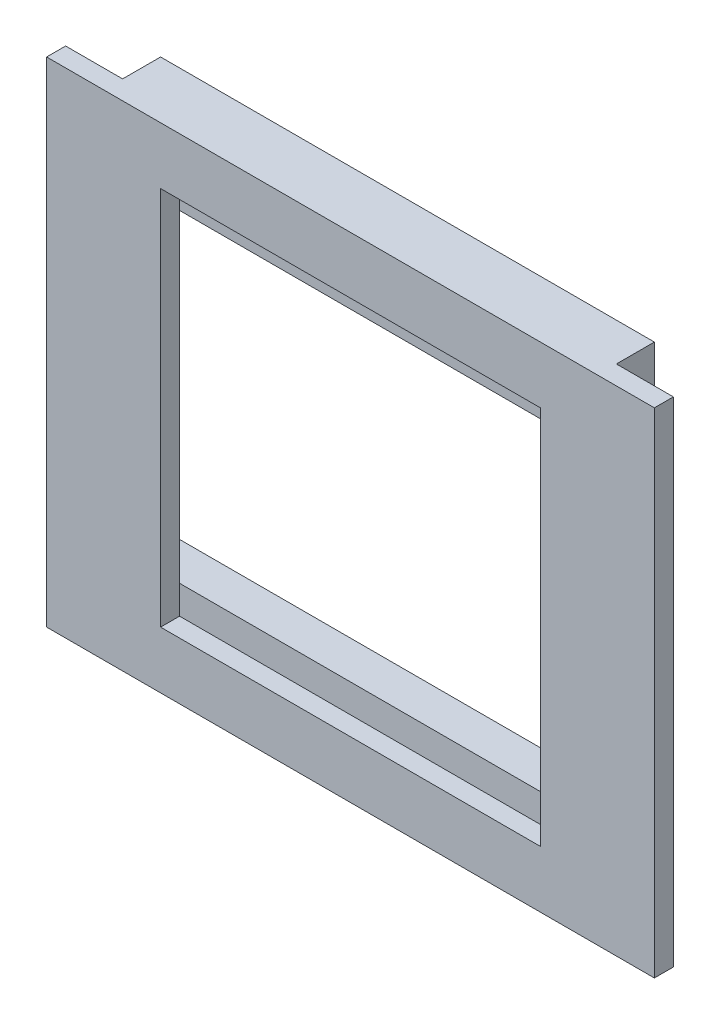
ISO-10303-21;
HEADER;
FILE_DESCRIPTION(('STEP AP214'),'2;1');
FILE_NAME('part.step','',(''),(''),'','','');
FILE_SCHEMA(('AUTOMOTIVE_DESIGN { 1 0 10303 214 1 1 1 1 }'));
ENDSEC;
DATA;
#1=APPLICATION_CONTEXT('core data for automotive mechanical design processes');
#2=APPLICATION_PROTOCOL_DEFINITION('international standard','automotive_design',2000,#1);
#3=PRODUCT_CONTEXT('',#1,'mechanical');
#4=PRODUCT('Part','Part','',(#3));
#5=PRODUCT_RELATED_PRODUCT_CATEGORY('part','',(#4));
#6=PRODUCT_DEFINITION_FORMATION('','',#4);
#7=PRODUCT_DEFINITION_CONTEXT('part definition',#1,'design');
#8=PRODUCT_DEFINITION('design','',#6,#7);
#9=PRODUCT_DEFINITION_SHAPE('','',#8);
#10=(LENGTH_UNIT() NAMED_UNIT(*) SI_UNIT(.MILLI.,.METRE.));
#11=(NAMED_UNIT(*) PLANE_ANGLE_UNIT() SI_UNIT($,.RADIAN.));
#12=(NAMED_UNIT(*) SI_UNIT($,.STERADIAN.) SOLID_ANGLE_UNIT());
#13=UNCERTAINTY_MEASURE_WITH_UNIT(LENGTH_MEASURE(1.E-05),#10,'distance_accuracy_value','');
#14=(GEOMETRIC_REPRESENTATION_CONTEXT(3) GLOBAL_UNCERTAINTY_ASSIGNED_CONTEXT((#13)) GLOBAL_UNIT_ASSIGNED_CONTEXT((#10,
#11,#12)) REPRESENTATION_CONTEXT('',''));
#15=CARTESIAN_POINT('',(0.,0.,0.));
#16=DIRECTION('',(0.,0.,1.));
#17=DIRECTION('',(1.,0.,0.));
#18=AXIS2_PLACEMENT_3D('',#15,#16,#17);
#19=CARTESIAN_POINT('',(0.,0.,10.));
#20=DIRECTION('',(0.,0.,1.));
#21=DIRECTION('',(1.,0.,0.));
#22=AXIS2_PLACEMENT_3D('',#19,#20,#21);
#23=PLANE('',#22);
#24=DIRECTION('',(1.,0.,0.));
#25=VECTOR('',#24,1.);
#26=CARTESIAN_POINT('',(0.,-56.3702928870293,10.));
#27=LINE('',#26,#25);
#28=CARTESIAN_POINT('',(-59.5188284518828,-56.3702928870293,9.99999999999999));
#29=VERTEX_POINT('',#28);
#30=CARTESIAN_POINT('',(40.4811715481172,-56.3702928870293,9.99999999999999));
#31=VERTEX_POINT('',#30);
#32=EDGE_CURVE('E285',#29,#31,#27,.T.);
#33=ORIENTED_EDGE('',*,*,#32,.F.);
#34=DIRECTION('',(0.,1.,0.));
#35=VECTOR('',#34,1.);
#36=CARTESIAN_POINT('',(-59.5188284518828,0.,10.));
#37=LINE('',#36,#35);
#38=CARTESIAN_POINT('',(-59.5188284518828,-63.8702928870293,10.));
#39=VERTEX_POINT('',#38);
#40=EDGE_CURVE('E301',#39,#29,#37,.T.);
#41=ORIENTED_EDGE('',*,*,#40,.F.);
#42=DIRECTION('',(1.,0.,0.));
#43=VECTOR('',#42,1.);
#44=CARTESIAN_POINT('',(0.,-63.8702928870293,10.));
#45=LINE('',#44,#43);
#46=CARTESIAN_POINT('',(40.4811715481172,-63.8702928870293,10.));
#47=VERTEX_POINT('',#46);
#48=EDGE_CURVE('E289',#39,#47,#45,.T.);
#49=ORIENTED_EDGE('',*,*,#48,.T.);
#50=DIRECTION('',(0.,1.,0.));
#51=VECTOR('',#50,1.);
#52=CARTESIAN_POINT('',(40.4811715481172,0.,10.));
#53=LINE('',#52,#51);
#54=EDGE_CURVE('E294',#47,#31,#53,.T.);
#55=ORIENTED_EDGE('',*,*,#54,.T.);
#56=EDGE_LOOP('',(#33,#41,#49,#55));
#57=FACE_BOUND('',#56,.T.);
#58=ADVANCED_FACE('F37',(#57),#23,.T.);
#59=CARTESIAN_POINT('',(0.,0.,0.));
#60=DIRECTION('',(0.,0.,1.));
#61=DIRECTION('',(1.,0.,0.));
#62=AXIS2_PLACEMENT_3D('',#59,#60,#61);
#63=PLANE('',#62);
#64=DIRECTION('',(0.,-1.,0.));
#65=VECTOR('',#64,1.);
#66=CARTESIAN_POINT('',(-74.5188284518828,51.1297071129707,0.));
#67=LINE('',#66,#65);
#68=CARTESIAN_POINT('',(-74.5188284518828,-56.3702928870293,0.));
#69=VERTEX_POINT('',#68);
#70=CARTESIAN_POINT('',(-74.5188284518828,-78.8702928870293,0.));
#71=VERTEX_POINT('',#70);
#72=EDGE_CURVE('E231',#69,#71,#67,.T.);
#73=ORIENTED_EDGE('',*,*,#72,.F.);
#74=DIRECTION('',(1.,0.,0.));
#75=VECTOR('',#74,1.);
#76=CARTESIAN_POINT('',(0.,-56.3702928870293,0.));
#77=LINE('',#76,#75);
#78=CARTESIAN_POINT('',(55.4811715481172,-56.3702928870293,0.));
#79=VERTEX_POINT('',#78);
#80=EDGE_CURVE('E181',#69,#79,#77,.T.);
#81=ORIENTED_EDGE('',*,*,#80,.T.);
#82=DIRECTION('',(0.,1.,0.));
#83=VECTOR('',#82,1.);
#84=CARTESIAN_POINT('',(55.4811715481172,51.1297071129707,0.));
#85=LINE('',#84,#83);
#86=CARTESIAN_POINT('',(55.4811715481172,-78.8702928870293,0.));
#87=VERTEX_POINT('',#86);
#88=EDGE_CURVE('E247',#87,#79,#85,.T.);
#89=ORIENTED_EDGE('',*,*,#88,.F.);
#90=DIRECTION('',(1.,0.,0.));
#91=VECTOR('',#90,1.);
#92=CARTESIAN_POINT('',(-74.5188284518828,-78.8702928870293,0.));
#93=LINE('',#92,#91);
#94=EDGE_CURVE('E243',#71,#87,#93,.T.);
#95=ORIENTED_EDGE('',*,*,#94,.F.);
#96=EDGE_LOOP('',(#73,#81,#89,#95));
#97=FACE_BOUND('',#96,.T.);
#98=ADVANCED_FACE('F266',(#97),#63,.F.);
#99=CARTESIAN_POINT('',(-74.5188284518828,51.1297071129707,15.));
#100=DIRECTION('',(1.,0.,0.));
#101=DIRECTION('',(0.,0.,-1.));
#102=AXIS2_PLACEMENT_3D('',#99,#100,#101);
#103=PLANE('',#102);
#104=DIRECTION('',(0.,1.,0.));
#105=VECTOR('',#104,1.);
#106=CARTESIAN_POINT('',(-74.5188284518828,51.1297071129707,10.));
#107=LINE('',#106,#105);
#108=CARTESIAN_POINT('',(-74.5188284518828,-78.8702928870293,10.));
#109=VERTEX_POINT('',#108);
#110=CARTESIAN_POINT('',(-74.5188284518828,-56.3702928870293,9.99999999999999));
#111=VERTEX_POINT('',#110);
#112=EDGE_CURVE('E168',#109,#111,#107,.T.);
#113=ORIENTED_EDGE('',*,*,#112,.T.);
#114=DIRECTION('',(0.,0.,-1.));
#115=VECTOR('',#114,1.);
#116=CARTESIAN_POINT('',(-74.5188284518828,-56.3702928870293,99.1852005660132));
#117=LINE('',#116,#115);
#118=EDGE_CURVE('E175',#111,#69,#117,.T.);
#119=ORIENTED_EDGE('',*,*,#118,.T.);
#120=ORIENTED_EDGE('',*,*,#72,.T.);
#121=DIRECTION('',(0.,0.,-1.));
#122=VECTOR('',#121,1.);
#123=CARTESIAN_POINT('',(-74.5188284518828,-78.8702928870293,15.));
#124=LINE('',#123,#122);
#125=EDGE_CURVE('E11',#109,#71,#124,.T.);
#126=ORIENTED_EDGE('',*,*,#125,.F.);
#127=EDGE_LOOP('',(#113,#119,#120,#126));
#128=FACE_BOUND('',#127,.T.);
#129=ADVANCED_FACE('F187',(#128),#103,.F.);
#130=CARTESIAN_POINT('',(55.4811715481172,51.1297071129707,15.));
#131=DIRECTION('',(-1.,0.,0.));
#132=DIRECTION('',(0.,-1.,0.));
#133=AXIS2_PLACEMENT_3D('',#130,#131,#132);
#134=PLANE('',#133);
#135=DIRECTION('',(0.,-1.,0.));
#136=VECTOR('',#135,1.);
#137=CARTESIAN_POINT('',(55.4811715481172,51.1297071129707,10.));
#138=LINE('',#137,#136);
#139=CARTESIAN_POINT('',(55.4811715481172,51.1297071129707,10.));
#140=VERTEX_POINT('',#139);
#141=CARTESIAN_POINT('',(55.4811715481172,28.6297071129707,9.99999999999999));
#142=VERTEX_POINT('',#141);
#143=EDGE_CURVE('E212',#140,#142,#138,.T.);
#144=ORIENTED_EDGE('',*,*,#143,.T.);
#145=DIRECTION('',(0.,0.,-1.));
#146=VECTOR('',#145,1.);
#147=CARTESIAN_POINT('',(55.4811715481172,28.6297071129707,99.1852005660132));
#148=LINE('',#147,#146);
#149=CARTESIAN_POINT('',(55.4811715481172,28.6297071129707,0.));
#150=VERTEX_POINT('',#149);
#151=EDGE_CURVE('E271',#142,#150,#148,.T.);
#152=ORIENTED_EDGE('',*,*,#151,.T.);
#153=CARTESIAN_POINT('',(55.4811715481172,51.1297071129707,0.));
#154=VERTEX_POINT('',#153);
#155=EDGE_CURVE('E246',#150,#154,#85,.T.);
#156=ORIENTED_EDGE('',*,*,#155,.T.);
#157=DIRECTION('',(0.,0.,-1.));
#158=VECTOR('',#157,1.);
#159=CARTESIAN_POINT('',(55.4811715481172,51.1297071129707,15.));
#160=LINE('',#159,#158);
#161=EDGE_CURVE('E253',#140,#154,#160,.T.);
#162=ORIENTED_EDGE('',*,*,#161,.F.);
#163=EDGE_LOOP('',(#144,#152,#156,#162));
#164=FACE_BOUND('',#163,.T.);
#165=ADVANCED_FACE('F359',(#164),#134,.F.);
#166=CARTESIAN_POINT('',(-59.5188284518828,28.6297071129707,9.99999999999999));
#167=VERTEX_POINT('',#166);
#168=CARTESIAN_POINT('',(-59.5188284518828,36.1297071129707,10.));
#169=VERTEX_POINT('',#168);
#170=EDGE_CURVE('E300',#167,#169,#37,.T.);
#171=ORIENTED_EDGE('',*,*,#170,.F.);
#172=DIRECTION('',(1.,0.,0.));
#173=VECTOR('',#172,1.);
#174=CARTESIAN_POINT('',(0.,28.6297071129707,10.));
#175=LINE('',#174,#173);
#176=CARTESIAN_POINT('',(40.4811715481172,28.6297071129707,9.99999999999999));
#177=VERTEX_POINT('',#176);
#178=EDGE_CURVE('E284',#167,#177,#175,.T.);
#179=ORIENTED_EDGE('',*,*,#178,.T.);
#180=CARTESIAN_POINT('',(40.4811715481172,36.1297071129707,10.));
#181=VERTEX_POINT('',#180);
#182=EDGE_CURVE('E292',#177,#181,#53,.T.);
#183=ORIENTED_EDGE('',*,*,#182,.T.);
#184=DIRECTION('',(1.,0.,0.));
#185=VECTOR('',#184,1.);
#186=CARTESIAN_POINT('',(0.,36.1297071129707,10.));
#187=LINE('',#186,#185);
#188=EDGE_CURVE('E297',#169,#181,#187,.T.);
#189=ORIENTED_EDGE('',*,*,#188,.F.);
#190=EDGE_LOOP('',(#171,#179,#183,#189));
#191=FACE_BOUND('',#190,.T.);
#192=ADVANCED_FACE('F333',(#191),#23,.T.);
#193=DIRECTION('',(1.,0.,0.));
#194=VECTOR('',#193,1.);
#195=CARTESIAN_POINT('',(0.,28.6297071129707,0.));
#196=LINE('',#195,#194);
#197=CARTESIAN_POINT('',(-74.5188284518828,28.6297071129707,0.));
#198=VERTEX_POINT('',#197);
#199=EDGE_CURVE('E267',#198,#150,#196,.T.);
#200=ORIENTED_EDGE('',*,*,#199,.F.);
#201=CARTESIAN_POINT('',(-74.5188284518828,51.1297071129707,0.));
#202=VERTEX_POINT('',#201);
#203=EDGE_CURVE('E240',#202,#198,#67,.T.);
#204=ORIENTED_EDGE('',*,*,#203,.F.);
#205=DIRECTION('',(-1.,0.,0.));
#206=VECTOR('',#205,1.);
#207=CARTESIAN_POINT('',(-74.5188284518828,51.1297071129707,0.));
#208=LINE('',#207,#206);
#209=EDGE_CURVE('E237',#154,#202,#208,.T.);
#210=ORIENTED_EDGE('',*,*,#209,.F.);
#211=ORIENTED_EDGE('',*,*,#155,.F.);
#212=EDGE_LOOP('',(#200,#204,#210,#211));
#213=FACE_BOUND('',#212,.T.);
#214=ADVANCED_FACE('F356',(#213),#63,.F.);
#215=ORIENTED_EDGE('',*,*,#203,.T.);
#216=DIRECTION('',(0.,0.,-1.));
#217=VECTOR('',#216,1.);
#218=CARTESIAN_POINT('',(-74.5188284518828,28.6297071129707,99.1852005660132));
#219=LINE('',#218,#217);
#220=CARTESIAN_POINT('',(-74.5188284518828,28.6297071129707,9.99999999999999));
#221=VERTEX_POINT('',#220);
#222=EDGE_CURVE('E184',#221,#198,#219,.T.);
#223=ORIENTED_EDGE('',*,*,#222,.F.);
#224=CARTESIAN_POINT('',(-74.5188284518828,51.1297071129707,10.));
#225=VERTEX_POINT('',#224);
#226=EDGE_CURVE('E60',#221,#225,#107,.T.);
#227=ORIENTED_EDGE('',*,*,#226,.T.);
#228=DIRECTION('',(0.,0.,-1.));
#229=VECTOR('',#228,1.);
#230=CARTESIAN_POINT('',(-74.5188284518828,51.1297071129707,15.));
#231=LINE('',#230,#229);
#232=EDGE_CURVE('E239',#225,#202,#231,.T.);
#233=ORIENTED_EDGE('',*,*,#232,.T.);
#234=EDGE_LOOP('',(#215,#223,#227,#233));
#235=FACE_BOUND('',#234,.T.);
#236=ADVANCED_FACE('F39',(#235),#103,.F.);
#237=CARTESIAN_POINT('',(-74.5188284518828,-78.8702928870293,15.));
#238=DIRECTION('',(0.,1.,0.));
#239=DIRECTION('',(0.,0.,1.));
#240=AXIS2_PLACEMENT_3D('',#237,#238,#239);
#241=PLANE('',#240);
#242=ORIENTED_EDGE('',*,*,#94,.T.);
#243=DIRECTION('',(0.,0.,-1.));
#244=VECTOR('',#243,1.);
#245=CARTESIAN_POINT('',(55.4811715481172,-78.8702928870293,15.));
#246=LINE('',#245,#244);
#247=CARTESIAN_POINT('',(55.4811715481172,-78.8702928870293,10.));
#248=VERTEX_POINT('',#247);
#249=EDGE_CURVE('E45',#248,#87,#246,.T.);
#250=ORIENTED_EDGE('',*,*,#249,.F.);
#251=DIRECTION('',(1.,0.,0.));
#252=VECTOR('',#251,1.);
#253=CARTESIAN_POINT('',(55.4811715481172,-78.8702928870293,10.));
#254=LINE('',#253,#252);
#255=CARTESIAN_POINT('',(70.4811715481172,-78.8702928870293,10.));
#256=VERTEX_POINT('',#255);
#257=EDGE_CURVE('E215',#248,#256,#254,.T.);
#258=ORIENTED_EDGE('',*,*,#257,.T.);
#259=DIRECTION('',(0.,0.,1.));
#260=VECTOR('',#259,1.);
#261=CARTESIAN_POINT('',(70.4811715481172,-78.8702928870293,10.));
#262=LINE('',#261,#260);
#263=CARTESIAN_POINT('',(70.4811715481172,-78.8702928870293,15.));
#264=VERTEX_POINT('',#263);
#265=EDGE_CURVE('E225',#256,#264,#262,.T.);
#266=ORIENTED_EDGE('',*,*,#265,.T.);
#267=DIRECTION('',(1.,0.,0.));
#268=VECTOR('',#267,1.);
#269=CARTESIAN_POINT('',(-74.5188284518828,-78.8702928870293,15.));
#270=LINE('',#269,#268);
#271=CARTESIAN_POINT('',(-89.5188284518828,-78.8702928870293,15.));
#272=VERTEX_POINT('',#271);
#273=EDGE_CURVE('E234',#272,#264,#270,.T.);
#274=ORIENTED_EDGE('',*,*,#273,.F.);
#275=DIRECTION('',(0.,0.,1.));
#276=VECTOR('',#275,1.);
#277=CARTESIAN_POINT('',(-89.5188284518828,-78.8702928870293,10.));
#278=LINE('',#277,#276);
#279=CARTESIAN_POINT('',(-89.5188284518828,-78.8702928870293,10.));
#280=VERTEX_POINT('',#279);
#281=EDGE_CURVE('E206',#280,#272,#278,.T.);
#282=ORIENTED_EDGE('',*,*,#281,.F.);
#283=DIRECTION('',(1.,0.,0.));
#284=VECTOR('',#283,1.);
#285=CARTESIAN_POINT('',(-74.5188284518828,-78.8702928870293,10.));
#286=LINE('',#285,#284);
#287=EDGE_CURVE('E200',#280,#109,#286,.T.);
#288=ORIENTED_EDGE('',*,*,#287,.T.);
#289=ORIENTED_EDGE('',*,*,#125,.T.);
#290=EDGE_LOOP('',(#242,#250,#258,#266,#274,#282,#288,#289));
#291=FACE_BOUND('',#290,.T.);
#292=ADVANCED_FACE('F264',(#291),#241,.F.);
#293=ORIENTED_EDGE('',*,*,#88,.T.);
#294=DIRECTION('',(0.,0.,-1.));
#295=VECTOR('',#294,1.);
#296=CARTESIAN_POINT('',(55.4811715481172,-56.3702928870293,99.1852005660132));
#297=LINE('',#296,#295);
#298=CARTESIAN_POINT('',(55.4811715481172,-56.3702928870293,9.99999999999999));
#299=VERTEX_POINT('',#298);
#300=EDGE_CURVE('E269',#299,#79,#297,.T.);
#301=ORIENTED_EDGE('',*,*,#300,.F.);
#302=EDGE_CURVE('E216',#299,#248,#138,.T.);
#303=ORIENTED_EDGE('',*,*,#302,.T.);
#304=ORIENTED_EDGE('',*,*,#249,.T.);
#305=EDGE_LOOP('',(#293,#301,#303,#304));
#306=FACE_BOUND('',#305,.T.);
#307=ADVANCED_FACE('F257',(#306),#134,.F.);
#308=CARTESIAN_POINT('',(-74.5188284518828,51.1297071129707,15.));
#309=DIRECTION('',(0.,-1.,0.));
#310=DIRECTION('',(0.,0.,-1.));
#311=AXIS2_PLACEMENT_3D('',#308,#309,#310);
#312=PLANE('',#311);
#313=ORIENTED_EDGE('',*,*,#209,.T.);
#314=ORIENTED_EDGE('',*,*,#232,.F.);
#315=DIRECTION('',(-1.,0.,0.));
#316=VECTOR('',#315,1.);
#317=CARTESIAN_POINT('',(-74.5188284518828,51.1297071129707,10.));
#318=LINE('',#317,#316);
#319=CARTESIAN_POINT('',(-89.5188284518828,51.1297071129707,10.));
#320=VERTEX_POINT('',#319);
#321=EDGE_CURVE('E188',#225,#320,#318,.T.);
#322=ORIENTED_EDGE('',*,*,#321,.T.);
#323=DIRECTION('',(0.,0.,1.));
#324=VECTOR('',#323,1.);
#325=CARTESIAN_POINT('',(-89.5188284518828,51.1297071129707,10.));
#326=LINE('',#325,#324);
#327=CARTESIAN_POINT('',(-89.5188284518828,51.1297071129707,15.));
#328=VERTEX_POINT('',#327);
#329=EDGE_CURVE('E202',#320,#328,#326,.T.);
#330=ORIENTED_EDGE('',*,*,#329,.T.);
#331=DIRECTION('',(-1.,0.,0.));
#332=VECTOR('',#331,1.);
#333=CARTESIAN_POINT('',(-74.5188284518828,51.1297071129707,15.));
#334=LINE('',#333,#332);
#335=CARTESIAN_POINT('',(70.4811715481172,51.1297071129707,15.));
#336=VERTEX_POINT('',#335);
#337=EDGE_CURVE('E236',#336,#328,#334,.T.);
#338=ORIENTED_EDGE('',*,*,#337,.F.);
#339=DIRECTION('',(0.,0.,1.));
#340=VECTOR('',#339,1.);
#341=CARTESIAN_POINT('',(70.4811715481172,51.1297071129707,10.));
#342=LINE('',#341,#340);
#343=CARTESIAN_POINT('',(70.4811715481172,51.1297071129707,10.));
#344=VERTEX_POINT('',#343);
#345=EDGE_CURVE('E228',#344,#336,#342,.T.);
#346=ORIENTED_EDGE('',*,*,#345,.F.);
#347=DIRECTION('',(-1.,0.,0.));
#348=VECTOR('',#347,1.);
#349=CARTESIAN_POINT('',(55.4811715481172,51.1297071129707,10.));
#350=LINE('',#349,#348);
#351=EDGE_CURVE('E222',#344,#140,#350,.T.);
#352=ORIENTED_EDGE('',*,*,#351,.T.);
#353=ORIENTED_EDGE('',*,*,#161,.T.);
#354=EDGE_LOOP('',(#313,#314,#322,#330,#338,#346,#352,#353));
#355=FACE_BOUND('',#354,.T.);
#356=ADVANCED_FACE('F372',(#355),#312,.F.);
#357=CARTESIAN_POINT('',(0.,0.,15.));
#358=DIRECTION('',(0.,0.,1.));
#359=DIRECTION('',(1.,0.,0.));
#360=AXIS2_PLACEMENT_3D('',#357,#358,#359);
#361=PLANE('',#360);
#362=DIRECTION('',(1.,0.,0.));
#363=VECTOR('',#362,1.);
#364=CARTESIAN_POINT('',(0.,-63.8702928870293,15.));
#365=LINE('',#364,#363);
#366=CARTESIAN_POINT('',(-59.5188284518828,-63.8702928870293,15.));
#367=VERTEX_POINT('',#366);
#368=CARTESIAN_POINT('',(40.4811715481172,-63.8702928870293,15.));
#369=VERTEX_POINT('',#368);
#370=EDGE_CURVE('E52',#367,#369,#365,.T.);
#371=ORIENTED_EDGE('',*,*,#370,.F.);
#372=DIRECTION('',(0.,1.,0.));
#373=VECTOR('',#372,1.);
#374=CARTESIAN_POINT('',(-59.5188284518828,0.,15.));
#375=LINE('',#374,#373);
#376=CARTESIAN_POINT('',(-59.5188284518828,36.1297071129707,15.));
#377=VERTEX_POINT('',#376);
#378=EDGE_CURVE('E293',#367,#377,#375,.T.);
#379=ORIENTED_EDGE('',*,*,#378,.T.);
#380=DIRECTION('',(1.,0.,0.));
#381=VECTOR('',#380,1.);
#382=CARTESIAN_POINT('',(0.,36.1297071129707,15.));
#383=LINE('',#382,#381);
#384=CARTESIAN_POINT('',(40.4811715481172,36.1297071129707,15.));
#385=VERTEX_POINT('',#384);
#386=EDGE_CURVE('E307',#377,#385,#383,.T.);
#387=ORIENTED_EDGE('',*,*,#386,.T.);
#388=DIRECTION('',(0.,1.,0.));
#389=VECTOR('',#388,1.);
#390=CARTESIAN_POINT('',(40.4811715481172,0.,15.));
#391=LINE('',#390,#389);
#392=EDGE_CURVE('E304',#369,#385,#391,.T.);
#393=ORIENTED_EDGE('',*,*,#392,.F.);
#394=EDGE_LOOP('',(#371,#379,#387,#393));
#395=FACE_BOUND('',#394,.T.);
#396=ORIENTED_EDGE('',*,*,#337,.T.);
#397=DIRECTION('',(0.,-1.,0.));
#398=VECTOR('',#397,1.);
#399=CARTESIAN_POINT('',(-89.5188284518828,51.1297071129707,15.));
#400=LINE('',#399,#398);
#401=EDGE_CURVE('E193',#328,#272,#400,.T.);
#402=ORIENTED_EDGE('',*,*,#401,.T.);
#403=ORIENTED_EDGE('',*,*,#273,.T.);
#404=DIRECTION('',(0.,1.,0.));
#405=VECTOR('',#404,1.);
#406=CARTESIAN_POINT('',(70.4811715481172,51.1297071129707,15.));
#407=LINE('',#406,#405);
#408=EDGE_CURVE('E209',#264,#336,#407,.T.);
#409=ORIENTED_EDGE('',*,*,#408,.T.);
#410=EDGE_LOOP('',(#396,#402,#403,#409));
#411=FACE_BOUND('',#410,.T.);
#412=ADVANCED_FACE('F324',(#395,#411),#361,.T.);
#413=CARTESIAN_POINT('',(70.4811715481172,51.1297071129707,10.));
#414=DIRECTION('',(1.,0.,0.));
#415=DIRECTION('',(0.,1.,0.));
#416=AXIS2_PLACEMENT_3D('',#413,#414,#415);
#417=PLANE('',#416);
#418=ORIENTED_EDGE('',*,*,#408,.F.);
#419=ORIENTED_EDGE('',*,*,#265,.F.);
#420=DIRECTION('',(0.,1.,0.));
#421=VECTOR('',#420,1.);
#422=CARTESIAN_POINT('',(70.4811715481172,51.1297071129707,10.));
#423=LINE('',#422,#421);
#424=EDGE_CURVE('E219',#256,#344,#423,.T.);
#425=ORIENTED_EDGE('',*,*,#424,.T.);
#426=ORIENTED_EDGE('',*,*,#345,.T.);
#427=EDGE_LOOP('',(#418,#419,#425,#426));
#428=FACE_BOUND('',#427,.T.);
#429=ADVANCED_FACE('F399',(#428),#417,.T.);
#430=CARTESIAN_POINT('',(0.,0.,10.));
#431=DIRECTION('',(0.,0.,1.));
#432=DIRECTION('',(1.,0.,0.));
#433=AXIS2_PLACEMENT_3D('',#430,#431,#432);
#434=PLANE('',#433);
#435=ORIENTED_EDGE('',*,*,#143,.F.);
#436=ORIENTED_EDGE('',*,*,#351,.F.);
#437=ORIENTED_EDGE('',*,*,#424,.F.);
#438=ORIENTED_EDGE('',*,*,#257,.F.);
#439=ORIENTED_EDGE('',*,*,#302,.F.);
#440=DIRECTION('',(-1.,0.,0.));
#441=VECTOR('',#440,1.);
#442=CARTESIAN_POINT('',(28.4811715481172,-56.3702928870293,9.99999999999999));
#443=LINE('',#442,#441);
#444=EDGE_CURVE('E176',#299,#31,#443,.T.);
#445=ORIENTED_EDGE('',*,*,#444,.T.);
#446=DIRECTION('',(0.,-1.,0.));
#447=VECTOR('',#446,1.);
#448=CARTESIAN_POINT('',(40.4811715481172,0.,10.));
#449=LINE('',#448,#447);
#450=EDGE_CURVE('E280',#177,#31,#449,.T.);
#451=ORIENTED_EDGE('',*,*,#450,.F.);
#452=DIRECTION('',(1.,0.,0.));
#453=VECTOR('',#452,1.);
#454=CARTESIAN_POINT('',(28.4811715481172,28.6297071129707,9.99999999999999));
#455=LINE('',#454,#453);
#456=EDGE_CURVE('E275',#177,#142,#455,.T.);
#457=ORIENTED_EDGE('',*,*,#456,.T.);
#458=EDGE_LOOP('',(#435,#436,#437,#438,#439,#445,#451,#457));
#459=FACE_BOUND('',#458,.T.);
#460=ADVANCED_FACE('F393',(#459),#434,.F.);
#461=CARTESIAN_POINT('',(-89.5188284518828,51.1297071129707,10.));
#462=DIRECTION('',(-1.,0.,0.));
#463=DIRECTION('',(0.,-1.,0.));
#464=AXIS2_PLACEMENT_3D('',#461,#462,#463);
#465=PLANE('',#464);
#466=ORIENTED_EDGE('',*,*,#401,.F.);
#467=ORIENTED_EDGE('',*,*,#329,.F.);
#468=DIRECTION('',(0.,-1.,0.));
#469=VECTOR('',#468,1.);
#470=CARTESIAN_POINT('',(-89.5188284518828,51.1297071129707,10.));
#471=LINE('',#470,#469);
#472=EDGE_CURVE('E191',#320,#280,#471,.T.);
#473=ORIENTED_EDGE('',*,*,#472,.T.);
#474=ORIENTED_EDGE('',*,*,#281,.T.);
#475=EDGE_LOOP('',(#466,#467,#473,#474));
#476=FACE_BOUND('',#475,.T.);
#477=ADVANCED_FACE('F402',(#476),#465,.T.);
#478=CARTESIAN_POINT('',(0.,0.,10.));
#479=DIRECTION('',(0.,0.,-1.));
#480=DIRECTION('',(-1.,0.,0.));
#481=AXIS2_PLACEMENT_3D('',#478,#479,#480);
#482=PLANE('',#481);
#483=ORIENTED_EDGE('',*,*,#112,.F.);
#484=ORIENTED_EDGE('',*,*,#287,.F.);
#485=ORIENTED_EDGE('',*,*,#472,.F.);
#486=ORIENTED_EDGE('',*,*,#321,.F.);
#487=ORIENTED_EDGE('',*,*,#226,.F.);
#488=DIRECTION('',(1.,0.,0.));
#489=VECTOR('',#488,1.);
#490=CARTESIAN_POINT('',(-47.5188284518828,28.6297071129707,9.99999999999999));
#491=LINE('',#490,#489);
#492=EDGE_CURVE('E281',#221,#167,#491,.T.);
#493=ORIENTED_EDGE('',*,*,#492,.T.);
#494=DIRECTION('',(0.,-1.,0.));
#495=VECTOR('',#494,1.);
#496=CARTESIAN_POINT('',(-59.5188284518828,0.,10.));
#497=LINE('',#496,#495);
#498=EDGE_CURVE('E172',#167,#29,#497,.T.);
#499=ORIENTED_EDGE('',*,*,#498,.T.);
#500=DIRECTION('',(-1.,0.,0.));
#501=VECTOR('',#500,1.);
#502=CARTESIAN_POINT('',(-47.5188284518829,-56.3702928870293,9.99999999999999));
#503=LINE('',#502,#501);
#504=EDGE_CURVE('E163',#29,#111,#503,.T.);
#505=ORIENTED_EDGE('',*,*,#504,.T.);
#506=EDGE_LOOP('',(#483,#484,#485,#486,#487,#493,#499,#505));
#507=FACE_BOUND('',#506,.T.);
#508=ADVANCED_FACE('F165',(#507),#482,.T.);
#509=CARTESIAN_POINT('',(0.,-63.8702928870293,10.));
#510=DIRECTION('',(0.,-1.,0.));
#511=DIRECTION('',(0.,0.,-1.));
#512=AXIS2_PLACEMENT_3D('',#509,#510,#511);
#513=PLANE('',#512);
#514=ORIENTED_EDGE('',*,*,#370,.T.);
#515=DIRECTION('',(0.,0.,1.));
#516=VECTOR('',#515,1.);
#517=CARTESIAN_POINT('',(40.4811715481172,-63.8702928870293,10.));
#518=LINE('',#517,#516);
#519=EDGE_CURVE('E195',#47,#369,#518,.T.);
#520=ORIENTED_EDGE('',*,*,#519,.F.);
#521=ORIENTED_EDGE('',*,*,#48,.F.);
#522=DIRECTION('',(0.,0.,1.));
#523=VECTOR('',#522,1.);
#524=CARTESIAN_POINT('',(-59.5188284518828,-63.8702928870293,10.));
#525=LINE('',#524,#523);
#526=EDGE_CURVE('E205',#39,#367,#525,.T.);
#527=ORIENTED_EDGE('',*,*,#526,.T.);
#528=EDGE_LOOP('',(#514,#520,#521,#527));
#529=FACE_BOUND('',#528,.T.);
#530=ADVANCED_FACE('F340',(#529),#513,.F.);
#531=CARTESIAN_POINT('',(-59.5188284518828,0.,10.));
#532=DIRECTION('',(1.,0.,0.));
#533=DIRECTION('',(0.,0.,-1.));
#534=AXIS2_PLACEMENT_3D('',#531,#532,#533);
#535=PLANE('',#534);
#536=ORIENTED_EDGE('',*,*,#378,.F.);
#537=ORIENTED_EDGE('',*,*,#526,.F.);
#538=ORIENTED_EDGE('',*,*,#40,.T.);
#539=ORIENTED_EDGE('',*,*,#498,.F.);
#540=ORIENTED_EDGE('',*,*,#170,.T.);
#541=DIRECTION('',(0.,0.,1.));
#542=VECTOR('',#541,1.);
#543=CARTESIAN_POINT('',(-59.5188284518828,36.1297071129707,10.));
#544=LINE('',#543,#542);
#545=EDGE_CURVE('E313',#169,#377,#544,.T.);
#546=ORIENTED_EDGE('',*,*,#545,.T.);
#547=EDGE_LOOP('',(#536,#537,#538,#539,#540,#546));
#548=FACE_BOUND('',#547,.T.);
#549=ADVANCED_FACE('F341',(#548),#535,.T.);
#550=CARTESIAN_POINT('',(0.,36.1297071129707,10.));
#551=DIRECTION('',(0.,-1.,0.));
#552=DIRECTION('',(0.,0.,-1.));
#553=AXIS2_PLACEMENT_3D('',#550,#551,#552);
#554=PLANE('',#553);
#555=ORIENTED_EDGE('',*,*,#386,.F.);
#556=ORIENTED_EDGE('',*,*,#545,.F.);
#557=ORIENTED_EDGE('',*,*,#188,.T.);
#558=DIRECTION('',(0.,0.,1.));
#559=VECTOR('',#558,1.);
#560=CARTESIAN_POINT('',(40.4811715481172,36.1297071129707,10.));
#561=LINE('',#560,#559);
#562=EDGE_CURVE('E314',#181,#385,#561,.T.);
#563=ORIENTED_EDGE('',*,*,#562,.T.);
#564=EDGE_LOOP('',(#555,#556,#557,#563));
#565=FACE_BOUND('',#564,.T.);
#566=ADVANCED_FACE('F328',(#565),#554,.T.);
#567=CARTESIAN_POINT('',(40.4811715481172,0.,10.));
#568=DIRECTION('',(1.,0.,0.));
#569=DIRECTION('',(0.,0.,-1.));
#570=AXIS2_PLACEMENT_3D('',#567,#568,#569);
#571=PLANE('',#570);
#572=ORIENTED_EDGE('',*,*,#392,.T.);
#573=ORIENTED_EDGE('',*,*,#562,.F.);
#574=ORIENTED_EDGE('',*,*,#182,.F.);
#575=ORIENTED_EDGE('',*,*,#450,.T.);
#576=ORIENTED_EDGE('',*,*,#54,.F.);
#577=ORIENTED_EDGE('',*,*,#519,.T.);
#578=EDGE_LOOP('',(#572,#573,#574,#575,#576,#577));
#579=FACE_BOUND('',#578,.T.);
#580=ADVANCED_FACE('F321',(#579),#571,.F.);
#581=CARTESIAN_POINT('',(0.,-56.3702928870293,0.));
#582=DIRECTION('',(0.,-1.,0.));
#583=DIRECTION('',(0.,0.,-1.));
#584=AXIS2_PLACEMENT_3D('',#581,#582,#583);
#585=PLANE('',#584);
#586=ORIENTED_EDGE('',*,*,#32,.T.);
#587=ORIENTED_EDGE('',*,*,#444,.F.);
#588=ORIENTED_EDGE('',*,*,#300,.T.);
#589=ORIENTED_EDGE('',*,*,#80,.F.);
#590=ORIENTED_EDGE('',*,*,#118,.F.);
#591=ORIENTED_EDGE('',*,*,#504,.F.);
#592=EDGE_LOOP('',(#586,#587,#588,#589,#590,#591));
#593=FACE_BOUND('',#592,.T.);
#594=ADVANCED_FACE('F179',(#593),#585,.F.);
#595=CARTESIAN_POINT('',(0.,28.6297071129707,0.));
#596=DIRECTION('',(0.,-1.,0.));
#597=DIRECTION('',(0.,0.,-1.));
#598=AXIS2_PLACEMENT_3D('',#595,#596,#597);
#599=PLANE('',#598);
#600=ORIENTED_EDGE('',*,*,#178,.F.);
#601=ORIENTED_EDGE('',*,*,#492,.F.);
#602=ORIENTED_EDGE('',*,*,#222,.T.);
#603=ORIENTED_EDGE('',*,*,#199,.T.);
#604=ORIENTED_EDGE('',*,*,#151,.F.);
#605=ORIENTED_EDGE('',*,*,#456,.F.);
#606=EDGE_LOOP('',(#600,#601,#602,#603,#604,#605));
#607=FACE_BOUND('',#606,.T.);
#608=ADVANCED_FACE('F390',(#607),#599,.T.);
#609=CLOSED_SHELL('',(#58,#98,#129,#165,#192,#214,#236,#292,#307,#356,#412,#429,#460,#477,#508,
#530,#549,#566,#580,#594,#608));
#610=MANIFOLD_SOLID_BREP('B2',#609);
#611=ADVANCED_BREP_SHAPE_REPRESENTATION('',(#18,#610),#14);
#612=SHAPE_DEFINITION_REPRESENTATION(#9,#611);
ENDSEC;
END-ISO-10303-21;
